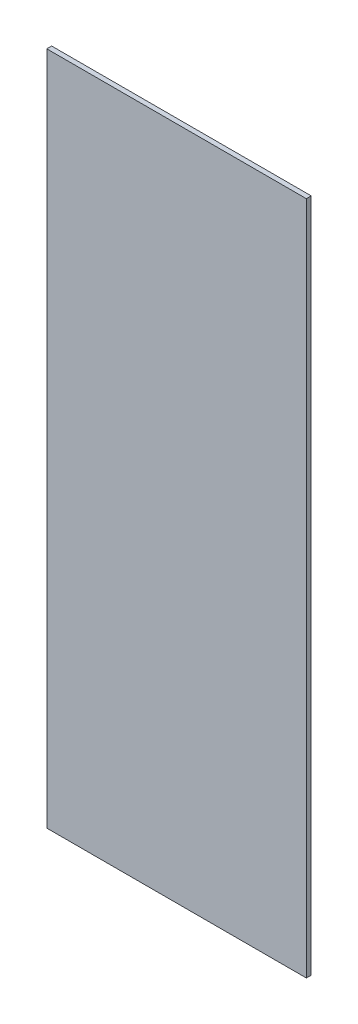
ISO-10303-21;
HEADER;
FILE_DESCRIPTION(('STEP AP214'),'2;1');
FILE_NAME('part.step','',(''),(''),'','','');
FILE_SCHEMA(('AUTOMOTIVE_DESIGN { 1 0 10303 214 1 1 1 1 }'));
ENDSEC;
DATA;
#1=APPLICATION_CONTEXT('core data for automotive mechanical design processes');
#2=APPLICATION_PROTOCOL_DEFINITION('international standard','automotive_design',2000,#1);
#3=PRODUCT_CONTEXT('',#1,'mechanical');
#4=PRODUCT('Part','Part','',(#3));
#5=PRODUCT_RELATED_PRODUCT_CATEGORY('part','',(#4));
#6=PRODUCT_DEFINITION_FORMATION('','',#4);
#7=PRODUCT_DEFINITION_CONTEXT('part definition',#1,'design');
#8=PRODUCT_DEFINITION('design','',#6,#7);
#9=PRODUCT_DEFINITION_SHAPE('','',#8);
#10=(LENGTH_UNIT() NAMED_UNIT(*) SI_UNIT(.MILLI.,.METRE.));
#11=(NAMED_UNIT(*) PLANE_ANGLE_UNIT() SI_UNIT($,.RADIAN.));
#12=(NAMED_UNIT(*) SI_UNIT($,.STERADIAN.) SOLID_ANGLE_UNIT());
#13=UNCERTAINTY_MEASURE_WITH_UNIT(LENGTH_MEASURE(1.E-05),#10,'distance_accuracy_value','');
#14=(GEOMETRIC_REPRESENTATION_CONTEXT(3) GLOBAL_UNCERTAINTY_ASSIGNED_CONTEXT((#13)) GLOBAL_UNIT_ASSIGNED_CONTEXT((#10,
#11,#12)) REPRESENTATION_CONTEXT('',''));
#15=CARTESIAN_POINT('',(0.,0.,0.));
#16=DIRECTION('',(0.,0.,1.));
#17=DIRECTION('',(1.,0.,0.));
#18=AXIS2_PLACEMENT_3D('',#15,#16,#17);
#19=CARTESIAN_POINT('',(160.,-416.,6.));
#20=DIRECTION('',(-1.,0.,0.));
#21=DIRECTION('',(0.,0.,1.));
#22=AXIS2_PLACEMENT_3D('',#19,#20,#21);
#23=PLANE('',#22);
#24=DIRECTION('',(0.,1.,0.));
#25=VECTOR('',#24,1.);
#26=CARTESIAN_POINT('',(160.,-416.,0.));
#27=LINE('',#26,#25);
#28=CARTESIAN_POINT('',(160.,-416.,0.));
#29=VERTEX_POINT('',#28);
#30=CARTESIAN_POINT('',(160.,416.,0.));
#31=VERTEX_POINT('',#30);
#32=EDGE_CURVE('E95',#29,#31,#27,.T.);
#33=ORIENTED_EDGE('',*,*,#32,.T.);
#34=DIRECTION('',(0.,0.,-1.));
#35=VECTOR('',#34,1.);
#36=CARTESIAN_POINT('',(160.,416.,6.));
#37=LINE('',#36,#35);
#38=CARTESIAN_POINT('',(160.,416.,6.));
#39=VERTEX_POINT('',#38);
#40=EDGE_CURVE('E11',#39,#31,#37,.T.);
#41=ORIENTED_EDGE('',*,*,#40,.F.);
#42=DIRECTION('',(0.,1.,0.));
#43=VECTOR('',#42,1.);
#44=CARTESIAN_POINT('',(160.,-416.,6.));
#45=LINE('',#44,#43);
#46=CARTESIAN_POINT('',(160.,-416.,6.));
#47=VERTEX_POINT('',#46);
#48=EDGE_CURVE('E83',#47,#39,#45,.T.);
#49=ORIENTED_EDGE('',*,*,#48,.F.);
#50=DIRECTION('',(0.,0.,-1.));
#51=VECTOR('',#50,1.);
#52=CARTESIAN_POINT('',(160.,-416.,6.));
#53=LINE('',#52,#51);
#54=EDGE_CURVE('E91',#47,#29,#53,.T.);
#55=ORIENTED_EDGE('',*,*,#54,.T.);
#56=EDGE_LOOP('',(#33,#41,#49,#55));
#57=FACE_BOUND('',#56,.T.);
#58=ADVANCED_FACE('F32',(#57),#23,.F.);
#59=CARTESIAN_POINT('',(-160.,416.,6.));
#60=DIRECTION('',(0.,-1.,0.));
#61=DIRECTION('',(0.,0.,-1.));
#62=AXIS2_PLACEMENT_3D('',#59,#60,#61);
#63=PLANE('',#62);
#64=DIRECTION('',(-1.,0.,0.));
#65=VECTOR('',#64,1.);
#66=CARTESIAN_POINT('',(-160.,416.,0.));
#67=LINE('',#66,#65);
#68=CARTESIAN_POINT('',(-160.,416.,0.));
#69=VERTEX_POINT('',#68);
#70=EDGE_CURVE('E87',#31,#69,#67,.T.);
#71=ORIENTED_EDGE('',*,*,#70,.T.);
#72=DIRECTION('',(0.,0.,-1.));
#73=VECTOR('',#72,1.);
#74=CARTESIAN_POINT('',(-160.,416.,6.));
#75=LINE('',#74,#73);
#76=CARTESIAN_POINT('',(-160.,416.,6.));
#77=VERTEX_POINT('',#76);
#78=EDGE_CURVE('E40',#77,#69,#75,.T.);
#79=ORIENTED_EDGE('',*,*,#78,.F.);
#80=DIRECTION('',(-1.,0.,0.));
#81=VECTOR('',#80,1.);
#82=CARTESIAN_POINT('',(-160.,416.,6.));
#83=LINE('',#82,#81);
#84=EDGE_CURVE('E78',#39,#77,#83,.T.);
#85=ORIENTED_EDGE('',*,*,#84,.F.);
#86=ORIENTED_EDGE('',*,*,#40,.T.);
#87=EDGE_LOOP('',(#71,#79,#85,#86));
#88=FACE_BOUND('',#87,.T.);
#89=ADVANCED_FACE('F86',(#88),#63,.F.);
#90=CARTESIAN_POINT('',(-160.,-416.,6.));
#91=DIRECTION('',(1.,0.,0.));
#92=DIRECTION('',(0.,0.,-1.));
#93=AXIS2_PLACEMENT_3D('',#90,#91,#92);
#94=PLANE('',#93);
#95=DIRECTION('',(0.,-1.,0.));
#96=VECTOR('',#95,1.);
#97=CARTESIAN_POINT('',(-160.,-416.,0.));
#98=LINE('',#97,#96);
#99=CARTESIAN_POINT('',(-160.,-416.,0.));
#100=VERTEX_POINT('',#99);
#101=EDGE_CURVE('E65',#69,#100,#98,.T.);
#102=ORIENTED_EDGE('',*,*,#101,.T.);
#103=DIRECTION('',(0.,0.,-1.));
#104=VECTOR('',#103,1.);
#105=CARTESIAN_POINT('',(-160.,-416.,6.));
#106=LINE('',#105,#104);
#107=CARTESIAN_POINT('',(-160.,-416.,6.));
#108=VERTEX_POINT('',#107);
#109=EDGE_CURVE('E88',#108,#100,#106,.T.);
#110=ORIENTED_EDGE('',*,*,#109,.F.);
#111=DIRECTION('',(0.,-1.,0.));
#112=VECTOR('',#111,1.);
#113=CARTESIAN_POINT('',(-160.,-416.,6.));
#114=LINE('',#113,#112);
#115=EDGE_CURVE('E81',#77,#108,#114,.T.);
#116=ORIENTED_EDGE('',*,*,#115,.F.);
#117=ORIENTED_EDGE('',*,*,#78,.T.);
#118=EDGE_LOOP('',(#102,#110,#116,#117));
#119=FACE_BOUND('',#118,.T.);
#120=ADVANCED_FACE('F89',(#119),#94,.F.);
#121=CARTESIAN_POINT('',(-160.,-416.,6.));
#122=DIRECTION('',(0.,1.,0.));
#123=DIRECTION('',(0.,0.,1.));
#124=AXIS2_PLACEMENT_3D('',#121,#122,#123);
#125=PLANE('',#124);
#126=DIRECTION('',(1.,0.,0.));
#127=VECTOR('',#126,1.);
#128=CARTESIAN_POINT('',(-160.,-416.,0.));
#129=LINE('',#128,#127);
#130=EDGE_CURVE('E71',#100,#29,#129,.T.);
#131=ORIENTED_EDGE('',*,*,#130,.T.);
#132=ORIENTED_EDGE('',*,*,#54,.F.);
#133=DIRECTION('',(1.,0.,0.));
#134=VECTOR('',#133,1.);
#135=CARTESIAN_POINT('',(-160.,-416.,6.));
#136=LINE('',#135,#134);
#137=EDGE_CURVE('E48',#108,#47,#136,.T.);
#138=ORIENTED_EDGE('',*,*,#137,.F.);
#139=ORIENTED_EDGE('',*,*,#109,.T.);
#140=EDGE_LOOP('',(#131,#132,#138,#139));
#141=FACE_BOUND('',#140,.T.);
#142=ADVANCED_FACE('F102',(#141),#125,.F.);
#143=CARTESIAN_POINT('',(0.,0.,6.));
#144=DIRECTION('',(0.,0.,-1.));
#145=DIRECTION('',(-1.,0.,0.));
#146=AXIS2_PLACEMENT_3D('',#143,#144,#145);
#147=PLANE('',#146);
#148=ORIENTED_EDGE('',*,*,#48,.T.);
#149=ORIENTED_EDGE('',*,*,#84,.T.);
#150=ORIENTED_EDGE('',*,*,#115,.T.);
#151=ORIENTED_EDGE('',*,*,#137,.T.);
#152=EDGE_LOOP('',(#148,#149,#150,#151));
#153=FACE_BOUND('',#152,.T.);
#154=ADVANCED_FACE('F79',(#153),#147,.F.);
#155=CARTESIAN_POINT('',(0.,0.,0.));
#156=DIRECTION('',(0.,0.,-1.));
#157=DIRECTION('',(-1.,0.,0.));
#158=AXIS2_PLACEMENT_3D('',#155,#156,#157);
#159=PLANE('',#158);
#160=ORIENTED_EDGE('',*,*,#32,.F.);
#161=ORIENTED_EDGE('',*,*,#130,.F.);
#162=ORIENTED_EDGE('',*,*,#101,.F.);
#163=ORIENTED_EDGE('',*,*,#70,.F.);
#164=EDGE_LOOP('',(#160,#161,#162,#163));
#165=FACE_BOUND('',#164,.T.);
#166=ADVANCED_FACE('F105',(#165),#159,.T.);
#167=CLOSED_SHELL('',(#58,#89,#120,#142,#154,#166));
#168=MANIFOLD_SOLID_BREP('B2',#167);
#169=ADVANCED_BREP_SHAPE_REPRESENTATION('',(#18,#168),#14);
#170=SHAPE_DEFINITION_REPRESENTATION(#9,#169);
ENDSEC;
END-ISO-10303-21;
